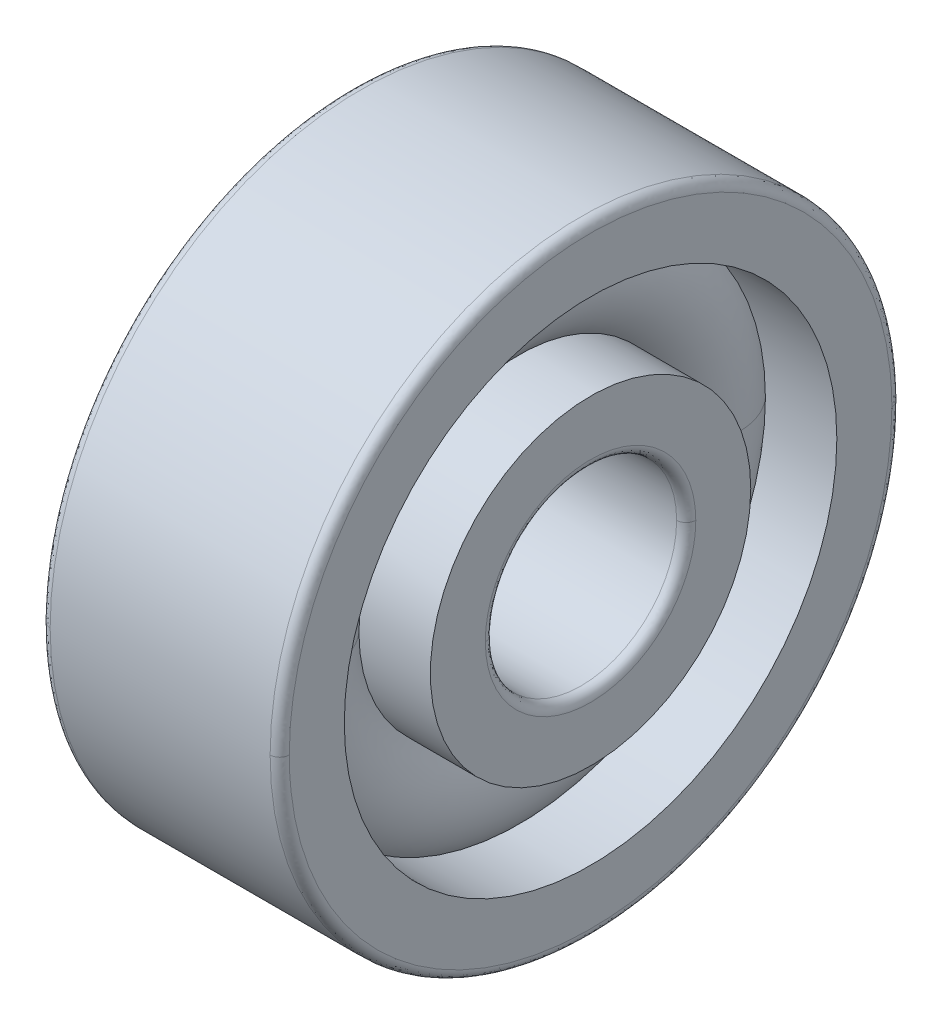
ISO-10303-21;
HEADER;
FILE_DESCRIPTION(('STEP AP214'),'2;1');
FILE_NAME('part.step','',(''),(''),'','','');
FILE_SCHEMA(('AUTOMOTIVE_DESIGN { 1 0 10303 214 1 1 1 1 }'));
ENDSEC;
DATA;
#1=APPLICATION_CONTEXT('core data for automotive mechanical design processes');
#2=APPLICATION_PROTOCOL_DEFINITION('international standard','automotive_design',2000,#1);
#3=PRODUCT_CONTEXT('',#1,'mechanical');
#4=PRODUCT('Part','Part','',(#3));
#5=PRODUCT_RELATED_PRODUCT_CATEGORY('part','',(#4));
#6=PRODUCT_DEFINITION_FORMATION('','',#4);
#7=PRODUCT_DEFINITION_CONTEXT('part definition',#1,'design');
#8=PRODUCT_DEFINITION('design','',#6,#7);
#9=PRODUCT_DEFINITION_SHAPE('','',#8);
#10=(LENGTH_UNIT() NAMED_UNIT(*) SI_UNIT(.MILLI.,.METRE.));
#11=(NAMED_UNIT(*) PLANE_ANGLE_UNIT() SI_UNIT($,.RADIAN.));
#12=(NAMED_UNIT(*) SI_UNIT($,.STERADIAN.) SOLID_ANGLE_UNIT());
#13=UNCERTAINTY_MEASURE_WITH_UNIT(LENGTH_MEASURE(1.E-05),#10,'distance_accuracy_value','');
#14=(GEOMETRIC_REPRESENTATION_CONTEXT(3) GLOBAL_UNCERTAINTY_ASSIGNED_CONTEXT((#13)) GLOBAL_UNIT_ASSIGNED_CONTEXT((#10,
#11,#12)) REPRESENTATION_CONTEXT('',''));
#15=CARTESIAN_POINT('',(0.,0.,0.));
#16=DIRECTION('',(0.,0.,1.));
#17=DIRECTION('',(1.,0.,0.));
#18=AXIS2_PLACEMENT_3D('',#15,#16,#17);
#19=CARTESIAN_POINT('',(2.280033317,0.,-2.000999167));
#20=CARTESIAN_POINT('',(2.280033317,4.001998334,-2.000999167));
#21=CARTESIAN_POINT('',(2.280033317,4.001998334,2.000999167));
#22=CARTESIAN_POINT('',(2.280033317,0.,2.000999167));
#23=CARTESIAN_POINT('',(2.416010753,0.,-1.987355915));
#24=CARTESIAN_POINT('',(2.416010753,3.974711831,-1.987355915));
#25=CARTESIAN_POINT('',(2.416010753,3.974711831,1.987355915));
#26=CARTESIAN_POINT('',(2.416010753,0.,1.987355915));
#27=CARTESIAN_POINT('',(2.512644085,0.,-2.083989247));
#28=CARTESIAN_POINT('',(2.512644085,4.167978494,-2.083989247));
#29=CARTESIAN_POINT('',(2.512644085,4.167978494,2.083989247));
#30=CARTESIAN_POINT('',(2.512644085,0.,2.083989247));
#31=CARTESIAN_POINT('',(2.499000833,0.,-2.219966683));
#32=CARTESIAN_POINT('',(2.499000833,4.439933367,-2.219966683));
#33=CARTESIAN_POINT('',(2.499000833,4.439933367,2.219966683));
#34=CARTESIAN_POINT('',(2.499000833,0.,2.219966683));
#35=(BOUNDED_SURFACE() B_SPLINE_SURFACE(3,3,((#19,#20,#21,#22),(#23,#24,#25,#26),(#27,#28,#29,
#30),(#31,#32,#33,#34)),.UNSPECIFIED.,.F.,.F.,.F.) B_SPLINE_SURFACE_WITH_KNOTS((4,4),(4,4),(0.,
1.),(0.,1.),.UNSPECIFIED.) GEOMETRIC_REPRESENTATION_ITEM() RATIONAL_B_SPLINE_SURFACE(((1.,
0.333333333333333,0.333333333333333,1.),(0.755320871117972,0.251773623705991,0.251773623705991,
0.755320871117972),(0.755320871117972,0.251773623705991,0.251773623705991,0.755320871117972),
(1.,0.333333333333333,0.333333333333333,1.))) REPRESENTATION_ITEM('') SURFACE());
#36=CARTESIAN_POINT('',(2.3,0.,0.));
#37=DIRECTION('',(1.,0.,0.));
#38=DIRECTION('',(0.,0.,-1.));
#39=AXIS2_PLACEMENT_3D('',#36,#37,#38);
#40=CIRCLE('',#39,2.);
#41=CARTESIAN_POINT('',(2.30000000009351,-2.69380885286199E-10,-1.9999999999971));
#42=VERTEX_POINT('',#41);
#43=CARTESIAN_POINT('',(2.30000000009351,-6.15310285545994E-10,1.9999999999971));
#44=VERTEX_POINT('',#43);
#45=EDGE_CURVE('E765',#42,#44,#40,.T.);
#46=CARTESIAN_POINT('',(2.280033317,0.,-2.000999167));
#47=CARTESIAN_POINT('',(2.416010753,0.,-1.987355915));
#48=CARTESIAN_POINT('',(2.512644085,0.,-2.083989247));
#49=CARTESIAN_POINT('',(2.499000833,0.,-2.219966683));
#50=(BOUNDED_CURVE() B_SPLINE_CURVE(3,(#46,#47,#48,#49),.UNSPECIFIED.,.F.,
.F.) B_SPLINE_CURVE_WITH_KNOTS((4,4),(0.,1.),
.UNSPECIFIED.) CURVE() GEOMETRIC_REPRESENTATION_ITEM() RATIONAL_B_SPLINE_CURVE((1.,
0.755320871117972,0.755320871117972,1.)) REPRESENTATION_ITEM(''));
#51=CARTESIAN_POINT('',(2.50000000000696,0.,-2.19999999872542));
#52=VERTEX_POINT('',#51);
#53=EDGE_CURVE('E109',#52,#42,#50,.F.);
#54=CARTESIAN_POINT('',(2.50000000001161,0.,-2.19999999940735));
#55=CARTESIAN_POINT('',(2.50000000001161,4.39999999968315,-2.19999999940735));
#56=CARTESIAN_POINT('',(2.50000000001161,4.39999999968315,2.19999999940735));
#57=CARTESIAN_POINT('',(2.50000000001161,0.,2.19999999940735));
#58=(BOUNDED_CURVE() B_SPLINE_CURVE(3,(#54,#55,#56,#57),.UNSPECIFIED.,.F.,
.F.) B_SPLINE_CURVE_WITH_KNOTS((4,4),(0.,1.),
.UNSPECIFIED.) CURVE() GEOMETRIC_REPRESENTATION_ITEM() RATIONAL_B_SPLINE_CURVE((0.956578301732849,
0.318859433910949,0.318859433910949,0.956578301732849)) REPRESENTATION_ITEM(''));
#59=CARTESIAN_POINT('',(2.50000000000696,0.,2.19999999872542));
#60=VERTEX_POINT('',#59);
#61=EDGE_CURVE('E103',#60,#52,#58,.F.);
#62=CARTESIAN_POINT('',(2.280033317,0.,2.000999167));
#63=CARTESIAN_POINT('',(2.416010753,0.,1.987355915));
#64=CARTESIAN_POINT('',(2.512644085,0.,2.083989247));
#65=CARTESIAN_POINT('',(2.499000833,0.,2.219966683));
#66=(BOUNDED_CURVE() B_SPLINE_CURVE(3,(#62,#63,#64,#65),.UNSPECIFIED.,.F.,
.F.) B_SPLINE_CURVE_WITH_KNOTS((4,4),(0.,1.),
.UNSPECIFIED.) CURVE() GEOMETRIC_REPRESENTATION_ITEM() RATIONAL_B_SPLINE_CURVE((1.,
0.755320871117972,0.755320871117972,1.)) REPRESENTATION_ITEM(''));
#67=EDGE_CURVE('E106',#44,#60,#66,.T.);
#68=ORIENTED_EDGE('',*,*,#45,.F.);
#69=ORIENTED_EDGE('',*,*,#53,.F.);
#70=ORIENTED_EDGE('',*,*,#61,.F.);
#71=ORIENTED_EDGE('',*,*,#67,.F.);
#72=EDGE_LOOP('',(#68,#69,#70,#71));
#73=FACE_BOUND('',#72,.T.);
#74=ADVANCED_FACE('F17',(#73),#35,.T.);
#75=CARTESIAN_POINT('',(2.280033317,0.,2.000999167));
#76=CARTESIAN_POINT('',(2.280033317,-4.001998334,2.000999167));
#77=CARTESIAN_POINT('',(2.280033317,-4.001998334,-2.000999167));
#78=CARTESIAN_POINT('',(2.280033317,0.,-2.000999167));
#79=CARTESIAN_POINT('',(2.416010753,0.,1.987355915));
#80=CARTESIAN_POINT('',(2.416010753,-3.974711831,1.987355915));
#81=CARTESIAN_POINT('',(2.416010753,-3.974711831,-1.987355915));
#82=CARTESIAN_POINT('',(2.416010753,0.,-1.987355915));
#83=CARTESIAN_POINT('',(2.512644085,0.,2.083989247));
#84=CARTESIAN_POINT('',(2.512644085,-4.167978494,2.083989247));
#85=CARTESIAN_POINT('',(2.512644085,-4.167978494,-2.083989247));
#86=CARTESIAN_POINT('',(2.512644085,0.,-2.083989247));
#87=CARTESIAN_POINT('',(2.499000833,0.,2.219966683));
#88=CARTESIAN_POINT('',(2.499000833,-4.439933367,2.219966683));
#89=CARTESIAN_POINT('',(2.499000833,-4.439933367,-2.219966683));
#90=CARTESIAN_POINT('',(2.499000833,0.,-2.219966683));
#91=(BOUNDED_SURFACE() B_SPLINE_SURFACE(3,3,((#75,#76,#77,#78),(#79,#80,#81,#82),(#83,#84,#85,
#86),(#87,#88,#89,#90)),.UNSPECIFIED.,.F.,.F.,.F.) B_SPLINE_SURFACE_WITH_KNOTS((4,4),(4,4),(0.,
1.),(0.,1.),.UNSPECIFIED.) GEOMETRIC_REPRESENTATION_ITEM() RATIONAL_B_SPLINE_SURFACE(((1.,
0.333333333333333,0.333333333333333,1.),(0.755320871117972,0.251773623705991,0.251773623705991,
0.755320871117972),(0.755320871117972,0.251773623705991,0.251773623705991,0.755320871117972),
(1.,0.333333333333333,0.333333333333333,1.))) REPRESENTATION_ITEM('') SURFACE());
#92=CARTESIAN_POINT('',(2.3,0.,0.));
#93=DIRECTION('',(1.,0.,0.));
#94=DIRECTION('',(0.,0.,-1.));
#95=AXIS2_PLACEMENT_3D('',#92,#93,#94);
#96=CIRCLE('',#95,2.);
#97=EDGE_CURVE('E115',#44,#42,#96,.T.);
#98=CARTESIAN_POINT('',(2.5000000000116,0.,2.19999999940735));
#99=CARTESIAN_POINT('',(2.50000000001161,-4.39999999968315,2.19999999940735));
#100=CARTESIAN_POINT('',(2.50000000001161,-4.39999999968315,-2.19999999940735));
#101=CARTESIAN_POINT('',(2.5000000000116,0.,-2.19999999940735));
#102=(BOUNDED_CURVE() B_SPLINE_CURVE(3,(#98,#99,#100,#101),.UNSPECIFIED.,.F.,
.F.) B_SPLINE_CURVE_WITH_KNOTS((4,4),(0.,1.),
.UNSPECIFIED.) CURVE() GEOMETRIC_REPRESENTATION_ITEM() RATIONAL_B_SPLINE_CURVE((0.956578301732848,
0.318859433910949,0.318859433910949,0.956578301732848)) REPRESENTATION_ITEM(''));
#103=EDGE_CURVE('E114',#52,#60,#102,.F.);
#104=ORIENTED_EDGE('',*,*,#53,.T.);
#105=ORIENTED_EDGE('',*,*,#97,.F.);
#106=ORIENTED_EDGE('',*,*,#67,.T.);
#107=ORIENTED_EDGE('',*,*,#103,.F.);
#108=EDGE_LOOP('',(#104,#105,#106,#107));
#109=FACE_BOUND('',#108,.T.);
#110=ADVANCED_FACE('F120',(#109),#91,.T.);
#111=CARTESIAN_POINT('',(-2.3,0.,0.));
#112=DIRECTION('',(1.,0.,0.));
#113=DIRECTION('',(0.,0.,-1.));
#114=AXIS2_PLACEMENT_3D('',#111,#112,#113);
#115=CYLINDRICAL_SURFACE('',#114,2.);
#116=ORIENTED_EDGE('',*,*,#45,.T.);
#117=ORIENTED_EDGE('',*,*,#97,.T.);
#118=EDGE_LOOP('',(#116,#117));
#119=FACE_BOUND('',#118,.T.);
#120=CARTESIAN_POINT('',(-2.30000000037402,0.,0.));
#121=DIRECTION('',(1.,0.,0.));
#122=DIRECTION('',(0.,1.,0.));
#123=AXIS2_PLACEMENT_3D('',#120,#121,#122);
#124=CIRCLE('',#123,1.99999999998839);
#125=CARTESIAN_POINT('',(-2.30000000037402,-2.05103428515331E-10,1.9999999999913));
#126=VERTEX_POINT('',#125);
#127=CARTESIAN_POINT('',(-2.30000000028051,-8.9793628428733E-11,-1.9999999999913));
#128=VERTEX_POINT('',#127);
#129=EDGE_CURVE('E325',#126,#128,#124,.T.);
#130=ORIENTED_EDGE('',*,*,#129,.F.);
#131=CARTESIAN_POINT('',(-2.30000000037402,0.,0.));
#132=DIRECTION('',(1.,0.,0.));
#133=DIRECTION('',(0.,1.,0.));
#134=AXIS2_PLACEMENT_3D('',#131,#132,#133);
#135=CIRCLE('',#134,1.99999999998839);
#136=EDGE_CURVE('E127',#128,#126,#135,.T.);
#137=ORIENTED_EDGE('',*,*,#136,.F.);
#138=EDGE_LOOP('',(#130,#137));
#139=FACE_BOUND('',#138,.T.);
#140=ADVANCED_FACE('F148',(#119,#139),#115,.F.);
#141=CARTESIAN_POINT('',(2.5,-3.3902,3.3902));
#142=DIRECTION('',(1.,0.,0.));
#143=DIRECTION('',(0.,0.,-1.));
#144=AXIS2_PLACEMENT_3D('',#141,#142,#143);
#145=PLANE('',#144);
#146=ORIENTED_EDGE('',*,*,#61,.T.);
#147=ORIENTED_EDGE('',*,*,#103,.T.);
#148=EDGE_LOOP('',(#146,#147));
#149=FACE_BOUND('',#148,.T.);
#150=CARTESIAN_POINT('',(2.5,0.,0.));
#151=DIRECTION('',(1.,0.,0.));
#152=DIRECTION('',(0.,0.,-1.));
#153=AXIS2_PLACEMENT_3D('',#150,#151,#152);
#154=CIRCLE('',#153,3.35);
#155=CARTESIAN_POINT('',(2.5,0.,-3.35));
#156=VERTEX_POINT('',#155);
#157=EDGE_CURVE('E22',#156,#156,#154,.T.);
#158=ORIENTED_EDGE('',*,*,#157,.T.);
#159=EDGE_LOOP('',(#158));
#160=FACE_BOUND('',#159,.T.);
#161=ADVANCED_FACE('F125',(#149,#160),#145,.T.);
#162=CARTESIAN_POINT('',(-2.499000833,0.,-2.219966683));
#163=CARTESIAN_POINT('',(-2.499000833,4.439933367,-2.219966683));
#164=CARTESIAN_POINT('',(-2.499000833,4.439933367,2.219966683));
#165=CARTESIAN_POINT('',(-2.499000833,0.,2.219966683));
#166=CARTESIAN_POINT('',(-2.512644085,0.,-2.083989247));
#167=CARTESIAN_POINT('',(-2.512644085,4.167978494,-2.083989247));
#168=CARTESIAN_POINT('',(-2.512644085,4.167978494,2.083989247));
#169=CARTESIAN_POINT('',(-2.512644085,0.,2.083989247));
#170=CARTESIAN_POINT('',(-2.416010753,0.,-1.987355915));
#171=CARTESIAN_POINT('',(-2.416010753,3.974711831,-1.987355915));
#172=CARTESIAN_POINT('',(-2.416010753,3.974711831,1.987355915));
#173=CARTESIAN_POINT('',(-2.416010753,0.,1.987355915));
#174=CARTESIAN_POINT('',(-2.280033317,0.,-2.000999167));
#175=CARTESIAN_POINT('',(-2.280033317,4.001998334,-2.000999167));
#176=CARTESIAN_POINT('',(-2.280033317,4.001998334,2.000999167));
#177=CARTESIAN_POINT('',(-2.280033317,0.,2.000999167));
#178=(BOUNDED_SURFACE() B_SPLINE_SURFACE(3,3,((#162,#163,#164,#165),(#166,#167,#168,#169),(#170,
#171,#172,#173),(#174,#175,#176,#177)),.UNSPECIFIED.,.F.,.F.,
.F.) B_SPLINE_SURFACE_WITH_KNOTS((4,4),(4,4),(0.,1.),(0.,1.),
.UNSPECIFIED.) GEOMETRIC_REPRESENTATION_ITEM() RATIONAL_B_SPLINE_SURFACE(((1.,0.333333333333333,
0.333333333333333,1.),(0.755320871117972,0.251773623705991,0.251773623705991,0.755320871117972),
(0.755320871117972,0.251773623705991,0.251773623705991,0.755320871117972),(1.,0.333333333333333,
0.333333333333333,1.))) REPRESENTATION_ITEM('') SURFACE());
#179=CARTESIAN_POINT('',(-2.50000000001161,0.,2.19999999940735));
#180=CARTESIAN_POINT('',(-2.5000000000116,4.39999999968315,2.19999999940735));
#181=CARTESIAN_POINT('',(-2.5000000000116,4.39999999968315,-2.19999999940735));
#182=CARTESIAN_POINT('',(-2.50000000001161,0.,-2.19999999940735));
#183=(BOUNDED_CURVE() B_SPLINE_CURVE(3,(#179,#180,#181,#182),.UNSPECIFIED.,.F.,
.F.) B_SPLINE_CURVE_WITH_KNOTS((4,4),(0.,1.),
.UNSPECIFIED.) CURVE() GEOMETRIC_REPRESENTATION_ITEM() RATIONAL_B_SPLINE_CURVE((0.956578301732849,
0.318859433910949,0.318859433910949,0.956578301732849)) REPRESENTATION_ITEM(''));
#184=CARTESIAN_POINT('',(-2.50000000000696,0.,-2.19999999872542));
#185=VERTEX_POINT('',#184);
#186=CARTESIAN_POINT('',(-2.50000000000696,0.,2.19999999872542));
#187=VERTEX_POINT('',#186);
#188=EDGE_CURVE('E457',#185,#187,#183,.F.);
#189=CARTESIAN_POINT('',(-2.499000833,0.,-2.219966683));
#190=CARTESIAN_POINT('',(-2.512644085,0.,-2.083989247));
#191=CARTESIAN_POINT('',(-2.416010753,0.,-1.987355915));
#192=CARTESIAN_POINT('',(-2.280033317,0.,-2.000999167));
#193=(BOUNDED_CURVE() B_SPLINE_CURVE(3,(#189,#190,#191,#192),.UNSPECIFIED.,.F.,
.F.) B_SPLINE_CURVE_WITH_KNOTS((4,4),(0.,1.),
.UNSPECIFIED.) CURVE() GEOMETRIC_REPRESENTATION_ITEM() RATIONAL_B_SPLINE_CURVE((1.,
0.755320871117972,0.755320871117972,1.)) REPRESENTATION_ITEM(''));
#194=EDGE_CURVE('E279',#128,#185,#193,.F.);
#195=CARTESIAN_POINT('',(-2.499000833,0.,2.219966683));
#196=CARTESIAN_POINT('',(-2.512644085,0.,2.083989247));
#197=CARTESIAN_POINT('',(-2.416010753,0.,1.987355915));
#198=CARTESIAN_POINT('',(-2.280033317,0.,2.000999167));
#199=(BOUNDED_CURVE() B_SPLINE_CURVE(3,(#195,#196,#197,#198),.UNSPECIFIED.,.F.,
.F.) B_SPLINE_CURVE_WITH_KNOTS((4,4),(0.,1.),
.UNSPECIFIED.) CURVE() GEOMETRIC_REPRESENTATION_ITEM() RATIONAL_B_SPLINE_CURVE((1.,
0.755320871117972,0.755320871117972,1.)) REPRESENTATION_ITEM(''));
#200=EDGE_CURVE('E322',#187,#126,#199,.T.);
#201=ORIENTED_EDGE('',*,*,#188,.F.);
#202=ORIENTED_EDGE('',*,*,#194,.F.);
#203=ORIENTED_EDGE('',*,*,#136,.T.);
#204=ORIENTED_EDGE('',*,*,#200,.F.);
#205=EDGE_LOOP('',(#201,#202,#203,#204));
#206=FACE_BOUND('',#205,.T.);
#207=ADVANCED_FACE('F147',(#206),#178,.T.);
#208=CARTESIAN_POINT('',(-2.499000833,0.,2.219966683));
#209=CARTESIAN_POINT('',(-2.499000833,-4.439933367,2.219966683));
#210=CARTESIAN_POINT('',(-2.499000833,-4.439933367,-2.219966683));
#211=CARTESIAN_POINT('',(-2.499000833,0.,-2.219966683));
#212=CARTESIAN_POINT('',(-2.512644085,0.,2.083989247));
#213=CARTESIAN_POINT('',(-2.512644085,-4.167978494,2.083989247));
#214=CARTESIAN_POINT('',(-2.512644085,-4.167978494,-2.083989247));
#215=CARTESIAN_POINT('',(-2.512644085,0.,-2.083989247));
#216=CARTESIAN_POINT('',(-2.416010753,0.,1.987355915));
#217=CARTESIAN_POINT('',(-2.416010753,-3.974711831,1.987355915));
#218=CARTESIAN_POINT('',(-2.416010753,-3.974711831,-1.987355915));
#219=CARTESIAN_POINT('',(-2.416010753,0.,-1.987355915));
#220=CARTESIAN_POINT('',(-2.280033317,0.,2.000999167));
#221=CARTESIAN_POINT('',(-2.280033317,-4.001998334,2.000999167));
#222=CARTESIAN_POINT('',(-2.280033317,-4.001998334,-2.000999167));
#223=CARTESIAN_POINT('',(-2.280033317,0.,-2.000999167));
#224=(BOUNDED_SURFACE() B_SPLINE_SURFACE(3,3,((#208,#209,#210,#211),(#212,#213,#214,#215),(#216,
#217,#218,#219),(#220,#221,#222,#223)),.UNSPECIFIED.,.F.,.F.,
.F.) B_SPLINE_SURFACE_WITH_KNOTS((4,4),(4,4),(0.,1.),(0.,1.),
.UNSPECIFIED.) GEOMETRIC_REPRESENTATION_ITEM() RATIONAL_B_SPLINE_SURFACE(((1.,0.333333333333333,
0.333333333333333,1.),(0.755320871117972,0.251773623705991,0.251773623705991,0.755320871117972),
(0.755320871117972,0.251773623705991,0.251773623705991,0.755320871117972),(1.,0.333333333333333,
0.333333333333333,1.))) REPRESENTATION_ITEM('') SURFACE());
#225=CARTESIAN_POINT('',(-2.5000000000116,0.,-2.19999999940735));
#226=CARTESIAN_POINT('',(-2.50000000001161,-4.39999999968315,-2.19999999940735));
#227=CARTESIAN_POINT('',(-2.50000000001161,-4.39999999968315,2.19999999940735));
#228=CARTESIAN_POINT('',(-2.5000000000116,0.,2.19999999940735));
#229=(BOUNDED_CURVE() B_SPLINE_CURVE(3,(#225,#226,#227,#228),.UNSPECIFIED.,.F.,
.F.) B_SPLINE_CURVE_WITH_KNOTS((4,4),(0.,1.),
.UNSPECIFIED.) CURVE() GEOMETRIC_REPRESENTATION_ITEM() RATIONAL_B_SPLINE_CURVE((0.956578301732848,
0.318859433910949,0.318859433910949,0.956578301732848)) REPRESENTATION_ITEM(''));
#230=EDGE_CURVE('E265',#187,#185,#229,.F.);
#231=ORIENTED_EDGE('',*,*,#194,.T.);
#232=ORIENTED_EDGE('',*,*,#230,.F.);
#233=ORIENTED_EDGE('',*,*,#200,.T.);
#234=ORIENTED_EDGE('',*,*,#129,.T.);
#235=EDGE_LOOP('',(#231,#232,#233,#234));
#236=FACE_BOUND('',#235,.T.);
#237=ADVANCED_FACE('F281',(#236),#224,.T.);
#238=CARTESIAN_POINT('',(1.00623059,0.,0.));
#239=DIRECTION('',(1.,0.,0.));
#240=DIRECTION('',(0.,0.,-1.));
#241=AXIS2_PLACEMENT_3D('',#238,#239,#240);
#242=CYLINDRICAL_SURFACE('',#241,3.35);
#243=CARTESIAN_POINT('',(1.00623058937326,0.,0.));
#244=DIRECTION('',(-1.,0.,0.));
#245=DIRECTION('',(0.,-1.,0.));
#246=AXIS2_PLACEMENT_3D('',#243,#244,#245);
#247=CIRCLE('',#246,3.35000000003667);
#248=CARTESIAN_POINT('',(1.00623058937326,-1.50404327618128E-10,-3.3500000000275));
#249=VERTEX_POINT('',#248);
#250=CARTESIAN_POINT('',(1.00623058952994,-3.4354824276318E-10,3.3500000000275));
#251=VERTEX_POINT('',#250);
#252=EDGE_CURVE('E241',#249,#251,#247,.T.);
#253=ORIENTED_EDGE('',*,*,#252,.F.);
#254=CARTESIAN_POINT('',(1.00623058937326,0.,0.));
#255=DIRECTION('',(-1.,0.,0.));
#256=DIRECTION('',(0.,-1.,0.));
#257=AXIS2_PLACEMENT_3D('',#254,#255,#256);
#258=CIRCLE('',#257,3.35000000003667);
#259=EDGE_CURVE('E260',#251,#249,#258,.T.);
#260=ORIENTED_EDGE('',*,*,#259,.F.);
#261=EDGE_LOOP('',(#253,#260));
#262=FACE_BOUND('',#261,.T.);
#263=ORIENTED_EDGE('',*,*,#157,.F.);
#264=EDGE_LOOP('',(#263));
#265=FACE_BOUND('',#264,.T.);
#266=ADVANCED_FACE('F158',(#262,#265),#242,.T.);
#267=CARTESIAN_POINT('',(-2.5,-3.3902,-3.3902));
#268=DIRECTION('',(-1.,0.,0.));
#269=DIRECTION('',(0.,0.,1.));
#270=AXIS2_PLACEMENT_3D('',#267,#268,#269);
#271=PLANE('',#270);
#272=ORIENTED_EDGE('',*,*,#188,.T.);
#273=ORIENTED_EDGE('',*,*,#230,.T.);
#274=EDGE_LOOP('',(#272,#273));
#275=FACE_BOUND('',#274,.T.);
#276=CARTESIAN_POINT('',(-2.5,0.,0.));
#277=DIRECTION('',(1.,0.,0.));
#278=DIRECTION('',(0.,1.,0.));
#279=AXIS2_PLACEMENT_3D('',#276,#277,#278);
#280=CIRCLE('',#279,3.35);
#281=CARTESIAN_POINT('',(-2.5,3.35,0.));
#282=VERTEX_POINT('',#281);
#283=EDGE_CURVE('E231',#282,#282,#280,.F.);
#284=ORIENTED_EDGE('',*,*,#283,.T.);
#285=EDGE_LOOP('',(#284));
#286=FACE_BOUND('',#285,.T.);
#287=ADVANCED_FACE('F153',(#275,#286),#271,.T.);
#288=CARTESIAN_POINT('',(0.911353553,0.,5.245959186));
#289=CARTESIAN_POINT('',(0.911353553,10.491918373,5.245959186));
#290=CARTESIAN_POINT('',(0.911353553,10.491918373,-5.245959186));
#291=CARTESIAN_POINT('',(0.911353553,0.,-5.245959186));
#292=CARTESIAN_POINT('',(1.536645878,0.,4.673784754));
#293=CARTESIAN_POINT('',(1.536645878,9.347569509,4.673784754));
#294=CARTESIAN_POINT('',(1.536645878,9.347569509,-4.673784754));
#295=CARTESIAN_POINT('',(1.536645878,0.,-4.673784754));
#296=CARTESIAN_POINT('',(1.536645878,0.,3.826215246));
#297=CARTESIAN_POINT('',(1.536645878,7.652430491,3.826215246));
#298=CARTESIAN_POINT('',(1.536645878,7.652430491,-3.826215246));
#299=CARTESIAN_POINT('',(1.536645878,0.,-3.826215246));
#300=CARTESIAN_POINT('',(0.911353553,0.,3.254040814));
#301=CARTESIAN_POINT('',(0.911353553,6.508081627,3.254040814));
#302=CARTESIAN_POINT('',(0.911353553,6.508081627,-3.254040814));
#303=CARTESIAN_POINT('',(0.911353553,0.,-3.254040814));
#304=(BOUNDED_SURFACE() B_SPLINE_SURFACE(3,3,((#288,#289,#290,#291),(#292,#293,#294,#295),(#296,
#297,#298,#299),(#300,#301,#302,#303)),.UNSPECIFIED.,.F.,.F.,
.F.) B_SPLINE_SURFACE_WITH_KNOTS((4,4),(4,4),(0.,1.),(0.,1.),
.UNSPECIFIED.) GEOMETRIC_REPRESENTATION_ITEM() RATIONAL_B_SPLINE_SURFACE(((1.,0.333333333333333,
0.333333333333333,1.),(0.783384470702986,0.261128156900996,0.261128156900996,0.783384470702986),
(0.783384470702986,0.261128156900996,0.261128156900996,0.783384470702986),(1.,0.333333333333333,
0.333333333333333,1.))) REPRESENTATION_ITEM('') SURFACE());
#305=CARTESIAN_POINT('',(1.00623059,0.,0.));
#306=DIRECTION('',(1.,0.,0.));
#307=DIRECTION('',(0.,0.,-1.));
#308=AXIS2_PLACEMENT_3D('',#305,#306,#307);
#309=CIRCLE('',#308,5.15);
#310=CARTESIAN_POINT('',(1.00623058984332,-1.58442398528093E-09,5.14999999999083));
#311=VERTEX_POINT('',#310);
#312=CARTESIAN_POINT('',(1.00623058984332,-6.93655779611963E-10,-5.14999999999083));
#313=VERTEX_POINT('',#312);
#314=EDGE_CURVE('E233',#311,#313,#309,.F.);
#315=CARTESIAN_POINT('',(0.911353553,0.,5.245959186));
#316=CARTESIAN_POINT('',(1.536645878,0.,4.673784754));
#317=CARTESIAN_POINT('',(1.536645878,0.,3.826215246));
#318=CARTESIAN_POINT('',(0.911353553,0.,3.254040814));
#319=(BOUNDED_CURVE() B_SPLINE_CURVE(3,(#315,#316,#317,#318),.UNSPECIFIED.,.F.,
.F.) B_SPLINE_CURVE_WITH_KNOTS((4,4),(0.,1.),
.UNSPECIFIED.) CURVE() GEOMETRIC_REPRESENTATION_ITEM() RATIONAL_B_SPLINE_CURVE((1.,
0.783384470702986,0.783384470702986,1.)) REPRESENTATION_ITEM(''));
#320=EDGE_CURVE('E234',#251,#311,#319,.F.);
#321=CARTESIAN_POINT('',(0.911353553,0.,-5.245959186));
#322=CARTESIAN_POINT('',(1.536645878,0.,-4.673784754));
#323=CARTESIAN_POINT('',(1.536645878,0.,-3.826215246));
#324=CARTESIAN_POINT('',(0.911353553,0.,-3.254040814));
#325=(BOUNDED_CURVE() B_SPLINE_CURVE(3,(#321,#322,#323,#324),.UNSPECIFIED.,.F.,
.F.) B_SPLINE_CURVE_WITH_KNOTS((4,4),(0.,1.),
.UNSPECIFIED.) CURVE() GEOMETRIC_REPRESENTATION_ITEM() RATIONAL_B_SPLINE_CURVE((1.,
0.783384470702986,0.783384470702986,1.)) REPRESENTATION_ITEM(''));
#326=EDGE_CURVE('E248',#313,#249,#325,.T.);
#327=ORIENTED_EDGE('',*,*,#314,.F.);
#328=ORIENTED_EDGE('',*,*,#320,.F.);
#329=ORIENTED_EDGE('',*,*,#259,.T.);
#330=ORIENTED_EDGE('',*,*,#326,.F.);
#331=EDGE_LOOP('',(#327,#328,#329,#330));
#332=FACE_BOUND('',#331,.T.);
#333=ADVANCED_FACE('F157',(#332),#304,.T.);
#334=CARTESIAN_POINT('',(0.911353553,0.,-5.245959186));
#335=CARTESIAN_POINT('',(0.911353553,-10.491918373,-5.245959186));
#336=CARTESIAN_POINT('',(0.911353553,-10.491918373,5.245959186));
#337=CARTESIAN_POINT('',(0.911353553,0.,5.245959186));
#338=CARTESIAN_POINT('',(1.536645878,0.,-4.673784754));
#339=CARTESIAN_POINT('',(1.536645878,-9.347569509,-4.673784754));
#340=CARTESIAN_POINT('',(1.536645878,-9.347569509,4.673784754));
#341=CARTESIAN_POINT('',(1.536645878,0.,4.673784754));
#342=CARTESIAN_POINT('',(1.536645878,0.,-3.826215246));
#343=CARTESIAN_POINT('',(1.536645878,-7.652430491,-3.826215246));
#344=CARTESIAN_POINT('',(1.536645878,-7.652430491,3.826215246));
#345=CARTESIAN_POINT('',(1.536645878,0.,3.826215246));
#346=CARTESIAN_POINT('',(0.911353553,0.,-3.254040814));
#347=CARTESIAN_POINT('',(0.911353553,-6.508081627,-3.254040814));
#348=CARTESIAN_POINT('',(0.911353553,-6.508081627,3.254040814));
#349=CARTESIAN_POINT('',(0.911353553,0.,3.254040814));
#350=(BOUNDED_SURFACE() B_SPLINE_SURFACE(3,3,((#334,#335,#336,#337),(#338,#339,#340,#341),(#342,
#343,#344,#345),(#346,#347,#348,#349)),.UNSPECIFIED.,.F.,.F.,
.F.) B_SPLINE_SURFACE_WITH_KNOTS((4,4),(4,4),(0.,1.),(0.,1.),
.UNSPECIFIED.) GEOMETRIC_REPRESENTATION_ITEM() RATIONAL_B_SPLINE_SURFACE(((1.,0.333333333333333,
0.333333333333333,1.),(0.783384470702986,0.261128156900996,0.261128156900996,0.783384470702986),
(0.783384470702986,0.261128156900996,0.261128156900996,0.783384470702986),(1.,0.333333333333333,
0.333333333333333,1.))) REPRESENTATION_ITEM('') SURFACE());
#351=CARTESIAN_POINT('',(1.00623059,0.,0.));
#352=DIRECTION('',(1.,0.,0.));
#353=DIRECTION('',(0.,0.,-1.));
#354=AXIS2_PLACEMENT_3D('',#351,#352,#353);
#355=CIRCLE('',#354,5.15);
#356=EDGE_CURVE('E238',#313,#311,#355,.F.);
#357=ORIENTED_EDGE('',*,*,#320,.T.);
#358=ORIENTED_EDGE('',*,*,#356,.F.);
#359=ORIENTED_EDGE('',*,*,#326,.T.);
#360=ORIENTED_EDGE('',*,*,#252,.T.);
#361=EDGE_LOOP('',(#357,#358,#359,#360));
#362=FACE_BOUND('',#361,.T.);
#363=ADVANCED_FACE('F449',(#362),#350,.T.);
#364=CARTESIAN_POINT('',(-2.5,0.,0.));
#365=DIRECTION('',(1.,0.,0.));
#366=DIRECTION('',(0.,1.,0.));
#367=AXIS2_PLACEMENT_3D('',#364,#365,#366);
#368=CYLINDRICAL_SURFACE('',#367,3.35);
#369=ORIENTED_EDGE('',*,*,#283,.F.);
#370=EDGE_LOOP('',(#369));
#371=FACE_BOUND('',#370,.T.);
#372=CARTESIAN_POINT('',(-1.00623058937326,0.,0.));
#373=DIRECTION('',(1.,0.,0.));
#374=DIRECTION('',(0.,1.,0.));
#375=AXIS2_PLACEMENT_3D('',#372,#373,#374);
#376=CIRCLE('',#375,3.35000000003667);
#377=CARTESIAN_POINT('',(-1.00623058937326,-2.25606491427603E-10,-3.3500000000275));
#378=VERTEX_POINT('',#377);
#379=CARTESIAN_POINT('',(-1.00623058937326,-3.4354824276318E-10,3.3500000000275));
#380=VERTEX_POINT('',#379);
#381=EDGE_CURVE('E429',#378,#380,#376,.T.);
#382=ORIENTED_EDGE('',*,*,#381,.F.);
#383=CARTESIAN_POINT('',(-1.00623058937326,0.,0.));
#384=DIRECTION('',(1.,0.,0.));
#385=DIRECTION('',(0.,1.,0.));
#386=AXIS2_PLACEMENT_3D('',#383,#384,#385);
#387=CIRCLE('',#386,3.35000000003667);
#388=EDGE_CURVE('E230',#380,#378,#387,.T.);
#389=ORIENTED_EDGE('',*,*,#388,.F.);
#390=EDGE_LOOP('',(#382,#389));
#391=FACE_BOUND('',#390,.T.);
#392=ADVANCED_FACE('F495',(#371,#391),#368,.T.);
#393=CARTESIAN_POINT('',(1.00623059,0.,0.));
#394=DIRECTION('',(1.,0.,0.));
#395=DIRECTION('',(0.,0.,-1.));
#396=AXIS2_PLACEMENT_3D('',#393,#394,#395);
#397=CYLINDRICAL_SURFACE('',#396,5.15);
#398=CARTESIAN_POINT('',(2.5,0.,0.));
#399=DIRECTION('',(1.,0.,0.));
#400=DIRECTION('',(0.,0.,-1.));
#401=AXIS2_PLACEMENT_3D('',#398,#399,#400);
#402=CIRCLE('',#401,5.15);
#403=CARTESIAN_POINT('',(2.5,0.,-5.15));
#404=VERTEX_POINT('',#403);
#405=EDGE_CURVE('E228',#404,#404,#402,.F.);
#406=ORIENTED_EDGE('',*,*,#405,.F.);
#407=EDGE_LOOP('',(#406));
#408=FACE_BOUND('',#407,.T.);
#409=ORIENTED_EDGE('',*,*,#356,.T.);
#410=ORIENTED_EDGE('',*,*,#314,.T.);
#411=EDGE_LOOP('',(#409,#410));
#412=FACE_BOUND('',#411,.T.);
#413=ADVANCED_FACE('F502',(#408,#412),#397,.F.);
#414=CARTESIAN_POINT('',(-0.911353553,0.,3.254040814));
#415=CARTESIAN_POINT('',(-0.911353553,6.508081627,3.254040814));
#416=CARTESIAN_POINT('',(-0.911353553,6.508081627,-3.254040814));
#417=CARTESIAN_POINT('',(-0.911353553,0.,-3.254040814));
#418=CARTESIAN_POINT('',(-1.536645878,0.,3.826215246));
#419=CARTESIAN_POINT('',(-1.536645878,7.652430491,3.826215246));
#420=CARTESIAN_POINT('',(-1.536645878,7.652430491,-3.826215246));
#421=CARTESIAN_POINT('',(-1.536645878,0.,-3.826215246));
#422=CARTESIAN_POINT('',(-1.536645878,0.,4.673784754));
#423=CARTESIAN_POINT('',(-1.536645878,9.347569509,4.673784754));
#424=CARTESIAN_POINT('',(-1.536645878,9.347569509,-4.673784754));
#425=CARTESIAN_POINT('',(-1.536645878,0.,-4.673784754));
#426=CARTESIAN_POINT('',(-0.911353553,0.,5.245959186));
#427=CARTESIAN_POINT('',(-0.911353553,10.491918373,5.245959186));
#428=CARTESIAN_POINT('',(-0.911353553,10.491918373,-5.245959186));
#429=CARTESIAN_POINT('',(-0.911353553,0.,-5.245959186));
#430=(BOUNDED_SURFACE() B_SPLINE_SURFACE(3,3,((#414,#415,#416,#417),(#418,#419,#420,#421),(#422,
#423,#424,#425),(#426,#427,#428,#429)),.UNSPECIFIED.,.F.,.F.,
.F.) B_SPLINE_SURFACE_WITH_KNOTS((4,4),(4,4),(0.,1.),(0.,1.),
.UNSPECIFIED.) GEOMETRIC_REPRESENTATION_ITEM() RATIONAL_B_SPLINE_SURFACE(((1.,0.333333333333333,
0.333333333333333,1.),(0.783384470702986,0.261128156900996,0.261128156900996,0.783384470702986),
(0.783384470702986,0.261128156900996,0.261128156900996,0.783384470702986),(1.,0.333333333333333,
0.333333333333333,1.))) REPRESENTATION_ITEM('') SURFACE());
#431=CARTESIAN_POINT('',(-0.911353553,0.,3.254040814));
#432=CARTESIAN_POINT('',(-1.536645878,0.,3.826215246));
#433=CARTESIAN_POINT('',(-1.536645878,0.,4.673784754));
#434=CARTESIAN_POINT('',(-0.911353553,0.,5.245959186));
#435=(BOUNDED_CURVE() B_SPLINE_CURVE(3,(#431,#432,#433,#434),.UNSPECIFIED.,.F.,
.F.) B_SPLINE_CURVE_WITH_KNOTS((4,4),(0.,1.),
.UNSPECIFIED.) CURVE() GEOMETRIC_REPRESENTATION_ITEM() RATIONAL_B_SPLINE_CURVE((1.,
0.783384470702986,0.783384470702986,1.)) REPRESENTATION_ITEM(''));
#436=CARTESIAN_POINT('',(-1.0062305899084,-1.58442398528093E-09,5.14999999991807));
#437=VERTEX_POINT('',#436);
#438=EDGE_CURVE('E441',#437,#380,#435,.F.);
#439=CARTESIAN_POINT('',(-1.00623059,0.,0.));
#440=DIRECTION('',(1.,0.,0.));
#441=DIRECTION('',(0.,0.,-1.));
#442=AXIS2_PLACEMENT_3D('',#439,#440,#441);
#443=CIRCLE('',#442,5.15);
#444=CARTESIAN_POINT('',(-1.00623058984332,-6.93655779611963E-10,-5.14999999999083));
#445=VERTEX_POINT('',#444);
#446=EDGE_CURVE('E685',#445,#437,#443,.T.);
#447=CARTESIAN_POINT('',(-0.911353553,0.,-3.254040814));
#448=CARTESIAN_POINT('',(-1.536645878,0.,-3.826215246));
#449=CARTESIAN_POINT('',(-1.536645878,0.,-4.673784754));
#450=CARTESIAN_POINT('',(-0.911353553,0.,-5.245959186));
#451=(BOUNDED_CURVE() B_SPLINE_CURVE(3,(#447,#448,#449,#450),.UNSPECIFIED.,.F.,
.F.) B_SPLINE_CURVE_WITH_KNOTS((4,4),(0.,1.),
.UNSPECIFIED.) CURVE() GEOMETRIC_REPRESENTATION_ITEM() RATIONAL_B_SPLINE_CURVE((1.,
0.783384470702986,0.783384470702986,1.)) REPRESENTATION_ITEM(''));
#452=EDGE_CURVE('E436',#378,#445,#451,.T.);
#453=ORIENTED_EDGE('',*,*,#381,.T.);
#454=ORIENTED_EDGE('',*,*,#438,.F.);
#455=ORIENTED_EDGE('',*,*,#446,.F.);
#456=ORIENTED_EDGE('',*,*,#452,.F.);
#457=EDGE_LOOP('',(#453,#454,#455,#456));
#458=FACE_BOUND('',#457,.T.);
#459=ADVANCED_FACE('F510',(#458),#430,.T.);
#460=CARTESIAN_POINT('',(-0.911353553,0.,-3.254040814));
#461=CARTESIAN_POINT('',(-0.911353553,-6.508081627,-3.254040814));
#462=CARTESIAN_POINT('',(-0.911353553,-6.508081627,3.254040814));
#463=CARTESIAN_POINT('',(-0.911353553,0.,3.254040814));
#464=CARTESIAN_POINT('',(-1.536645878,0.,-3.826215246));
#465=CARTESIAN_POINT('',(-1.536645878,-7.652430491,-3.826215246));
#466=CARTESIAN_POINT('',(-1.536645878,-7.652430491,3.826215246));
#467=CARTESIAN_POINT('',(-1.536645878,0.,3.826215246));
#468=CARTESIAN_POINT('',(-1.536645878,0.,-4.673784754));
#469=CARTESIAN_POINT('',(-1.536645878,-9.347569509,-4.673784754));
#470=CARTESIAN_POINT('',(-1.536645878,-9.347569509,4.673784754));
#471=CARTESIAN_POINT('',(-1.536645878,0.,4.673784754));
#472=CARTESIAN_POINT('',(-0.911353553,0.,-5.245959186));
#473=CARTESIAN_POINT('',(-0.911353553,-10.491918373,-5.245959186));
#474=CARTESIAN_POINT('',(-0.911353553,-10.491918373,5.245959186));
#475=CARTESIAN_POINT('',(-0.911353553,0.,5.245959186));
#476=(BOUNDED_SURFACE() B_SPLINE_SURFACE(3,3,((#460,#461,#462,#463),(#464,#465,#466,#467),(#468,
#469,#470,#471),(#472,#473,#474,#475)),.UNSPECIFIED.,.F.,.F.,
.F.) B_SPLINE_SURFACE_WITH_KNOTS((4,4),(4,4),(0.,1.),(0.,1.),
.UNSPECIFIED.) GEOMETRIC_REPRESENTATION_ITEM() RATIONAL_B_SPLINE_SURFACE(((1.,0.333333333333333,
0.333333333333333,1.),(0.783384470702986,0.261128156900996,0.261128156900996,0.783384470702986),
(0.783384470702986,0.261128156900996,0.261128156900996,0.783384470702986),(1.,0.333333333333333,
0.333333333333333,1.))) REPRESENTATION_ITEM('') SURFACE());
#477=CARTESIAN_POINT('',(-1.00623059,0.,0.));
#478=DIRECTION('',(1.,0.,0.));
#479=DIRECTION('',(0.,0.,-1.));
#480=AXIS2_PLACEMENT_3D('',#477,#478,#479);
#481=CIRCLE('',#480,5.15);
#482=EDGE_CURVE('E657',#437,#445,#481,.T.);
#483=ORIENTED_EDGE('',*,*,#438,.T.);
#484=ORIENTED_EDGE('',*,*,#388,.T.);
#485=ORIENTED_EDGE('',*,*,#452,.T.);
#486=ORIENTED_EDGE('',*,*,#482,.F.);
#487=EDGE_LOOP('',(#483,#484,#485,#486));
#488=FACE_BOUND('',#487,.T.);
#489=ADVANCED_FACE('F414',(#488),#476,.T.);
#490=CARTESIAN_POINT('',(2.5,-6.3756,6.3756));
#491=DIRECTION('',(1.,0.,0.));
#492=DIRECTION('',(0.,0.,-1.));
#493=AXIS2_PLACEMENT_3D('',#490,#491,#492);
#494=PLANE('',#493);
#495=ORIENTED_EDGE('',*,*,#405,.T.);
#496=EDGE_LOOP('',(#495));
#497=FACE_BOUND('',#496,.T.);
#498=CARTESIAN_POINT('',(2.5000000000116,0.,6.30000000059265));
#499=CARTESIAN_POINT('',(2.50000000001161,12.6000000003168,6.30000000059265));
#500=CARTESIAN_POINT('',(2.50000000001161,12.6000000003168,-6.30000000059265));
#501=CARTESIAN_POINT('',(2.5000000000116,0.,-6.30000000059265));
#502=(BOUNDED_CURVE() B_SPLINE_CURVE(3,(#498,#499,#500,#501),.UNSPECIFIED.,.F.,
.F.) B_SPLINE_CURVE_WITH_KNOTS((4,4),(0.,1.),
.UNSPECIFIED.) CURVE() GEOMETRIC_REPRESENTATION_ITEM() RATIONAL_B_SPLINE_CURVE((0.956578301732851,
0.31885943391095,0.31885943391095,0.956578301732851)) REPRESENTATION_ITEM(''));
#503=CARTESIAN_POINT('',(2.50000000000696,0.,6.29999999906194));
#504=VERTEX_POINT('',#503);
#505=CARTESIAN_POINT('',(2.50000000000696,0.,-6.29999999906194));
#506=VERTEX_POINT('',#505);
#507=EDGE_CURVE('E180',#504,#506,#502,.T.);
#508=ORIENTED_EDGE('',*,*,#507,.F.);
#509=CARTESIAN_POINT('',(2.50000000001161,0.,-6.30000000059265));
#510=CARTESIAN_POINT('',(2.5000000000116,-12.6000000003168,-6.30000000059265));
#511=CARTESIAN_POINT('',(2.5000000000116,-12.6000000003168,6.30000000059265));
#512=CARTESIAN_POINT('',(2.50000000001161,0.,6.30000000059265));
#513=(BOUNDED_CURVE() B_SPLINE_CURVE(3,(#509,#510,#511,#512),.UNSPECIFIED.,.F.,
.F.) B_SPLINE_CURVE_WITH_KNOTS((4,4),(0.,1.),
.UNSPECIFIED.) CURVE() GEOMETRIC_REPRESENTATION_ITEM() RATIONAL_B_SPLINE_CURVE((0.956578301732854,
0.318859433910951,0.318859433910951,0.956578301732854)) REPRESENTATION_ITEM(''));
#514=EDGE_CURVE('E191',#506,#504,#513,.T.);
#515=ORIENTED_EDGE('',*,*,#514,.F.);
#516=EDGE_LOOP('',(#508,#515));
#517=FACE_BOUND('',#516,.T.);
#518=ADVANCED_FACE('F160',(#497,#517),#494,.T.);
#519=CARTESIAN_POINT('',(2.499000833,0.,6.280033317));
#520=CARTESIAN_POINT('',(2.499000833,-12.560066633,6.280033317));
#521=CARTESIAN_POINT('',(2.499000833,-12.560066633,-6.280033317));
#522=CARTESIAN_POINT('',(2.499000833,0.,-6.280033317));
#523=CARTESIAN_POINT('',(2.512644085,0.,6.416010753));
#524=CARTESIAN_POINT('',(2.512644085,-12.832021506,6.416010753));
#525=CARTESIAN_POINT('',(2.512644085,-12.832021506,-6.416010753));
#526=CARTESIAN_POINT('',(2.512644085,0.,-6.416010753));
#527=CARTESIAN_POINT('',(2.416010753,0.,6.512644085));
#528=CARTESIAN_POINT('',(2.416010753,-13.025288169,6.512644085));
#529=CARTESIAN_POINT('',(2.416010753,-13.025288169,-6.512644085));
#530=CARTESIAN_POINT('',(2.416010753,0.,-6.512644085));
#531=CARTESIAN_POINT('',(2.280033317,0.,6.499000833));
#532=CARTESIAN_POINT('',(2.280033317,-12.998001666,6.499000833));
#533=CARTESIAN_POINT('',(2.280033317,-12.998001666,-6.499000833));
#534=CARTESIAN_POINT('',(2.280033317,0.,-6.499000833));
#535=(BOUNDED_SURFACE() B_SPLINE_SURFACE(3,3,((#519,#520,#521,#522),(#523,#524,#525,#526),(#527,
#528,#529,#530),(#531,#532,#533,#534)),.UNSPECIFIED.,.F.,.F.,
.F.) B_SPLINE_SURFACE_WITH_KNOTS((4,4),(4,4),(0.,1.),(0.,1.),
.UNSPECIFIED.) GEOMETRIC_REPRESENTATION_ITEM() RATIONAL_B_SPLINE_SURFACE(((1.,0.333333333333333,
0.333333333333333,1.),(0.755320871117973,0.251773623705991,0.251773623705991,0.755320871117973),
(0.755320871117973,0.251773623705991,0.251773623705991,0.755320871117973),(1.,0.333333333333333,
0.333333333333333,1.))) REPRESENTATION_ITEM('') SURFACE());
#536=CARTESIAN_POINT('',(2.499000833,0.,-6.280033317));
#537=CARTESIAN_POINT('',(2.512644085,0.,-6.416010753));
#538=CARTESIAN_POINT('',(2.416010753,0.,-6.512644085));
#539=CARTESIAN_POINT('',(2.280033317,0.,-6.499000833));
#540=(BOUNDED_CURVE() B_SPLINE_CURVE(3,(#536,#537,#538,#539),.UNSPECIFIED.,.F.,
.F.) B_SPLINE_CURVE_WITH_KNOTS((4,4),(0.,1.),
.UNSPECIFIED.) CURVE() GEOMETRIC_REPRESENTATION_ITEM() RATIONAL_B_SPLINE_CURVE((1.,
0.755320871117973,0.755320871117973,1.)) REPRESENTATION_ITEM(''));
#541=CARTESIAN_POINT('',(2.30000000023376,-2.91829292393382E-10,-6.50000000000725));
#542=VERTEX_POINT('',#541);
#543=EDGE_CURVE('E662',#506,#542,#540,.T.);
#544=CARTESIAN_POINT('',(2.499000833,0.,6.280033317));
#545=CARTESIAN_POINT('',(2.512644085,0.,6.416010753));
#546=CARTESIAN_POINT('',(2.416010753,0.,6.512644085));
#547=CARTESIAN_POINT('',(2.280033317,0.,6.499000833));
#548=(BOUNDED_CURVE() B_SPLINE_CURVE(3,(#544,#545,#546,#547),.UNSPECIFIED.,.F.,
.F.) B_SPLINE_CURVE_WITH_KNOTS((4,4),(0.,1.),
.UNSPECIFIED.) CURVE() GEOMETRIC_REPRESENTATION_ITEM() RATIONAL_B_SPLINE_CURVE((1.,
0.755320871117973,0.755320871117973,1.)) REPRESENTATION_ITEM(''));
#549=CARTESIAN_POINT('',(2.30000000028051,0.,6.50000000001161));
#550=VERTEX_POINT('',#549);
#551=EDGE_CURVE('E650',#550,#504,#548,.F.);
#552=CARTESIAN_POINT('',(2.3,0.,0.));
#553=DIRECTION('',(1.,0.,0.));
#554=DIRECTION('',(0.,0.,-1.));
#555=AXIS2_PLACEMENT_3D('',#552,#553,#554);
#556=CIRCLE('',#555,6.5);
#557=EDGE_CURVE('E668',#550,#542,#556,.T.);
#558=ORIENTED_EDGE('',*,*,#543,.F.);
#559=ORIENTED_EDGE('',*,*,#514,.T.);
#560=ORIENTED_EDGE('',*,*,#551,.F.);
#561=ORIENTED_EDGE('',*,*,#557,.T.);
#562=EDGE_LOOP('',(#558,#559,#560,#561));
#563=FACE_BOUND('',#562,.T.);
#564=ADVANCED_FACE('F402',(#563),#535,.T.);
#565=CARTESIAN_POINT('',(-2.280033317,0.,6.499000833));
#566=CARTESIAN_POINT('',(-2.280033317,-12.998001666,6.499000833));
#567=CARTESIAN_POINT('',(-2.280033317,-12.998001666,-6.499000833));
#568=CARTESIAN_POINT('',(-2.280033317,0.,-6.499000833));
#569=CARTESIAN_POINT('',(-2.416010753,0.,6.512644085));
#570=CARTESIAN_POINT('',(-2.416010753,-13.025288169,6.512644085));
#571=CARTESIAN_POINT('',(-2.416010753,-13.025288169,-6.512644085));
#572=CARTESIAN_POINT('',(-2.416010753,0.,-6.512644085));
#573=CARTESIAN_POINT('',(-2.512644085,0.,6.416010753));
#574=CARTESIAN_POINT('',(-2.512644085,-12.832021506,6.416010753));
#575=CARTESIAN_POINT('',(-2.512644085,-12.832021506,-6.416010753));
#576=CARTESIAN_POINT('',(-2.512644085,0.,-6.416010753));
#577=CARTESIAN_POINT('',(-2.499000833,0.,6.280033317));
#578=CARTESIAN_POINT('',(-2.499000833,-12.560066633,6.280033317));
#579=CARTESIAN_POINT('',(-2.499000833,-12.560066633,-6.280033317));
#580=CARTESIAN_POINT('',(-2.499000833,0.,-6.280033317));
#581=(BOUNDED_SURFACE() B_SPLINE_SURFACE(3,3,((#565,#566,#567,#568),(#569,#570,#571,#572),(#573,
#574,#575,#576),(#577,#578,#579,#580)),.UNSPECIFIED.,.F.,.F.,
.F.) B_SPLINE_SURFACE_WITH_KNOTS((4,4),(4,4),(0.,1.),(0.,1.),
.UNSPECIFIED.) GEOMETRIC_REPRESENTATION_ITEM() RATIONAL_B_SPLINE_SURFACE(((1.,0.333333333333333,
0.333333333333333,1.),(0.755320871117973,0.251773623705991,0.251773623705991,0.755320871117973),
(0.755320871117973,0.251773623705991,0.251773623705991,0.755320871117973),(1.,0.333333333333333,
0.333333333333333,1.))) REPRESENTATION_ITEM('') SURFACE());
#582=CARTESIAN_POINT('',(-2.280033317,0.,-6.499000833));
#583=CARTESIAN_POINT('',(-2.416010753,0.,-6.512644085));
#584=CARTESIAN_POINT('',(-2.512644085,0.,-6.416010753));
#585=CARTESIAN_POINT('',(-2.499000833,0.,-6.280033317));
#586=(BOUNDED_CURVE() B_SPLINE_CURVE(3,(#582,#583,#584,#585),.UNSPECIFIED.,.F.,
.F.) B_SPLINE_CURVE_WITH_KNOTS((4,4),(0.,1.),
.UNSPECIFIED.) CURVE() GEOMETRIC_REPRESENTATION_ITEM() RATIONAL_B_SPLINE_CURVE((1.,
0.755320871117973,0.755320871117973,1.)) REPRESENTATION_ITEM(''));
#587=CARTESIAN_POINT('',(-2.50000000000696,0.,-6.29999999906194));
#588=VERTEX_POINT('',#587);
#589=CARTESIAN_POINT('',(-2.30000000037402,0.,-6.50000000001161));
#590=VERTEX_POINT('',#589);
#591=EDGE_CURVE('E37',#588,#590,#586,.F.);
#592=CARTESIAN_POINT('',(-2.3,0.,0.));
#593=DIRECTION('',(1.,0.,0.));
#594=DIRECTION('',(0.,0.,-1.));
#595=AXIS2_PLACEMENT_3D('',#592,#593,#594);
#596=CIRCLE('',#595,6.5);
#597=CARTESIAN_POINT('',(-2.30000000024545,-1.16652574968083E-09,6.5000000000058));
#598=VERTEX_POINT('',#597);
#599=EDGE_CURVE('E682',#590,#598,#596,.F.);
#600=CARTESIAN_POINT('',(-2.280033317,0.,6.499000833));
#601=CARTESIAN_POINT('',(-2.416010753,0.,6.512644085));
#602=CARTESIAN_POINT('',(-2.512644085,0.,6.416010753));
#603=CARTESIAN_POINT('',(-2.499000833,0.,6.280033317));
#604=(BOUNDED_CURVE() B_SPLINE_CURVE(3,(#600,#601,#602,#603),.UNSPECIFIED.,.F.,
.F.) B_SPLINE_CURVE_WITH_KNOTS((4,4),(0.,1.),
.UNSPECIFIED.) CURVE() GEOMETRIC_REPRESENTATION_ITEM() RATIONAL_B_SPLINE_CURVE((1.,
0.755320871117973,0.755320871117973,1.)) REPRESENTATION_ITEM(''));
#605=CARTESIAN_POINT('',(-2.50000000000696,0.,6.29999999906194));
#606=VERTEX_POINT('',#605);
#607=EDGE_CURVE('E387',#598,#606,#604,.T.);
#608=CARTESIAN_POINT('',(-2.50000000001161,0.,6.30000000059265));
#609=CARTESIAN_POINT('',(-2.5000000000116,-12.6000000003168,6.30000000059265));
#610=CARTESIAN_POINT('',(-2.5000000000116,-12.6000000003168,-6.30000000059265));
#611=CARTESIAN_POINT('',(-2.50000000001161,0.,-6.30000000059265));
#612=(BOUNDED_CURVE() B_SPLINE_CURVE(3,(#608,#609,#610,#611),.UNSPECIFIED.,.F.,
.F.) B_SPLINE_CURVE_WITH_KNOTS((4,4),(0.,1.),
.UNSPECIFIED.) CURVE() GEOMETRIC_REPRESENTATION_ITEM() RATIONAL_B_SPLINE_CURVE((0.956578301732857,
0.318859433910952,0.318859433910952,0.956578301732857)) REPRESENTATION_ITEM(''));
#613=EDGE_CURVE('E215',#588,#606,#612,.F.);
#614=ORIENTED_EDGE('',*,*,#591,.T.);
#615=ORIENTED_EDGE('',*,*,#599,.T.);
#616=ORIENTED_EDGE('',*,*,#607,.T.);
#617=ORIENTED_EDGE('',*,*,#613,.F.);
#618=EDGE_LOOP('',(#614,#615,#616,#617));
#619=FACE_BOUND('',#618,.T.);
#620=ADVANCED_FACE('F389',(#619),#581,.T.);
#621=CARTESIAN_POINT('',(-2.5,0.,0.));
#622=DIRECTION('',(1.,0.,0.));
#623=DIRECTION('',(0.,1.,0.));
#624=AXIS2_PLACEMENT_3D('',#621,#622,#623);
#625=CYLINDRICAL_SURFACE('',#624,5.15);
#626=ORIENTED_EDGE('',*,*,#446,.T.);
#627=ORIENTED_EDGE('',*,*,#482,.T.);
#628=EDGE_LOOP('',(#626,#627));
#629=FACE_BOUND('',#628,.T.);
#630=CARTESIAN_POINT('',(-2.5,0.,0.));
#631=DIRECTION('',(1.,0.,0.));
#632=DIRECTION('',(0.,1.,0.));
#633=AXIS2_PLACEMENT_3D('',#630,#631,#632);
#634=CIRCLE('',#633,5.15);
#635=CARTESIAN_POINT('',(-2.5,5.15,0.));
#636=VERTEX_POINT('',#635);
#637=EDGE_CURVE('E219',#636,#636,#634,.T.);
#638=ORIENTED_EDGE('',*,*,#637,.F.);
#639=EDGE_LOOP('',(#638));
#640=FACE_BOUND('',#639,.T.);
#641=ADVANCED_FACE('F401',(#629,#640),#625,.F.);
#642=CARTESIAN_POINT('',(2.499000833,0.,-6.280033317));
#643=CARTESIAN_POINT('',(2.499000833,12.560066633,-6.280033317));
#644=CARTESIAN_POINT('',(2.499000833,12.560066633,6.280033317));
#645=CARTESIAN_POINT('',(2.499000833,0.,6.280033317));
#646=CARTESIAN_POINT('',(2.512644085,0.,-6.416010753));
#647=CARTESIAN_POINT('',(2.512644085,12.832021506,-6.416010753));
#648=CARTESIAN_POINT('',(2.512644085,12.832021506,6.416010753));
#649=CARTESIAN_POINT('',(2.512644085,0.,6.416010753));
#650=CARTESIAN_POINT('',(2.416010753,0.,-6.512644085));
#651=CARTESIAN_POINT('',(2.416010753,13.025288169,-6.512644085));
#652=CARTESIAN_POINT('',(2.416010753,13.025288169,6.512644085));
#653=CARTESIAN_POINT('',(2.416010753,0.,6.512644085));
#654=CARTESIAN_POINT('',(2.280033317,0.,-6.499000833));
#655=CARTESIAN_POINT('',(2.280033317,12.998001666,-6.499000833));
#656=CARTESIAN_POINT('',(2.280033317,12.998001666,6.499000833));
#657=CARTESIAN_POINT('',(2.280033317,0.,6.499000833));
#658=(BOUNDED_SURFACE() B_SPLINE_SURFACE(3,3,((#642,#643,#644,#645),(#646,#647,#648,#649),(#650,
#651,#652,#653),(#654,#655,#656,#657)),.UNSPECIFIED.,.F.,.F.,
.F.) B_SPLINE_SURFACE_WITH_KNOTS((4,4),(4,4),(0.,1.),(0.,1.),
.UNSPECIFIED.) GEOMETRIC_REPRESENTATION_ITEM() RATIONAL_B_SPLINE_SURFACE(((1.,0.333333333333333,
0.333333333333333,1.),(0.755320871117973,0.251773623705991,0.251773623705991,0.755320871117973),
(0.755320871117973,0.251773623705991,0.251773623705991,0.755320871117973),(1.,0.333333333333333,
0.333333333333333,1.))) REPRESENTATION_ITEM('') SURFACE());
#659=CARTESIAN_POINT('',(2.3,0.,0.));
#660=DIRECTION('',(1.,0.,0.));
#661=DIRECTION('',(0.,0.,-1.));
#662=AXIS2_PLACEMENT_3D('',#659,#660,#661);
#663=CIRCLE('',#662,6.5);
#664=EDGE_CURVE('E227',#542,#550,#663,.T.);
#665=ORIENTED_EDGE('',*,*,#507,.T.);
#666=ORIENTED_EDGE('',*,*,#543,.T.);
#667=ORIENTED_EDGE('',*,*,#664,.T.);
#668=ORIENTED_EDGE('',*,*,#551,.T.);
#669=EDGE_LOOP('',(#665,#666,#667,#668));
#670=FACE_BOUND('',#669,.T.);
#671=ADVANCED_FACE('F544',(#670),#658,.T.);
#672=CARTESIAN_POINT('',(-2.5,-6.3756,-6.3756));
#673=DIRECTION('',(-1.,0.,0.));
#674=DIRECTION('',(0.,0.,1.));
#675=AXIS2_PLACEMENT_3D('',#672,#673,#674);
#676=PLANE('',#675);
#677=ORIENTED_EDGE('',*,*,#637,.T.);
#678=EDGE_LOOP('',(#677));
#679=FACE_BOUND('',#678,.T.);
#680=CARTESIAN_POINT('',(-2.50000000001161,0.,-6.30000000059265));
#681=CARTESIAN_POINT('',(-2.5000000000116,12.6000000003168,-6.30000000059265));
#682=CARTESIAN_POINT('',(-2.5000000000116,12.6000000003168,6.30000000059265));
#683=CARTESIAN_POINT('',(-2.50000000001161,0.,6.30000000059265));
#684=(BOUNDED_CURVE() B_SPLINE_CURVE(3,(#680,#681,#682,#683),.UNSPECIFIED.,.F.,
.F.) B_SPLINE_CURVE_WITH_KNOTS((4,4),(0.,1.),
.UNSPECIFIED.) CURVE() GEOMETRIC_REPRESENTATION_ITEM() RATIONAL_B_SPLINE_CURVE((0.956578301732858,
0.318859433910952,0.318859433910952,0.956578301732858)) REPRESENTATION_ITEM(''));
#685=EDGE_CURVE('E28',#588,#606,#684,.T.);
#686=ORIENTED_EDGE('',*,*,#685,.F.);
#687=ORIENTED_EDGE('',*,*,#613,.T.);
#688=EDGE_LOOP('',(#686,#687));
#689=FACE_BOUND('',#688,.T.);
#690=ADVANCED_FACE('F19',(#679,#689),#676,.T.);
#691=CARTESIAN_POINT('',(-2.3,0.,0.));
#692=DIRECTION('',(1.,0.,0.));
#693=DIRECTION('',(0.,0.,-1.));
#694=AXIS2_PLACEMENT_3D('',#691,#692,#693);
#695=CYLINDRICAL_SURFACE('',#694,6.5);
#696=ORIENTED_EDGE('',*,*,#664,.F.);
#697=ORIENTED_EDGE('',*,*,#557,.F.);
#698=EDGE_LOOP('',(#696,#697));
#699=FACE_BOUND('',#698,.T.);
#700=CARTESIAN_POINT('',(-2.30000000037402,0.,0.));
#701=DIRECTION('',(-1.,0.,0.));
#702=DIRECTION('',(0.,-1.,0.));
#703=AXIS2_PLACEMENT_3D('',#700,#701,#702);
#704=CIRCLE('',#703,6.50000000001161);
#705=EDGE_CURVE('E11',#598,#590,#704,.T.);
#706=ORIENTED_EDGE('',*,*,#705,.F.);
#707=ORIENTED_EDGE('',*,*,#599,.F.);
#708=EDGE_LOOP('',(#706,#707));
#709=FACE_BOUND('',#708,.T.);
#710=ADVANCED_FACE('F355',(#699,#709),#695,.T.);
#711=CARTESIAN_POINT('',(-2.280033317,0.,-6.499000833));
#712=CARTESIAN_POINT('',(-2.280033317,12.998001666,-6.499000833));
#713=CARTESIAN_POINT('',(-2.280033317,12.998001666,6.499000833));
#714=CARTESIAN_POINT('',(-2.280033317,0.,6.499000833));
#715=CARTESIAN_POINT('',(-2.416010753,0.,-6.512644085));
#716=CARTESIAN_POINT('',(-2.416010753,13.025288169,-6.512644085));
#717=CARTESIAN_POINT('',(-2.416010753,13.025288169,6.512644085));
#718=CARTESIAN_POINT('',(-2.416010753,0.,6.512644085));
#719=CARTESIAN_POINT('',(-2.512644085,0.,-6.416010753));
#720=CARTESIAN_POINT('',(-2.512644085,12.832021506,-6.416010753));
#721=CARTESIAN_POINT('',(-2.512644085,12.832021506,6.416010753));
#722=CARTESIAN_POINT('',(-2.512644085,0.,6.416010753));
#723=CARTESIAN_POINT('',(-2.499000833,0.,-6.280033317));
#724=CARTESIAN_POINT('',(-2.499000833,12.560066633,-6.280033317));
#725=CARTESIAN_POINT('',(-2.499000833,12.560066633,6.280033317));
#726=CARTESIAN_POINT('',(-2.499000833,0.,6.280033317));
#727=(BOUNDED_SURFACE() B_SPLINE_SURFACE(3,3,((#711,#712,#713,#714),(#715,#716,#717,#718),(#719,
#720,#721,#722),(#723,#724,#725,#726)),.UNSPECIFIED.,.F.,.F.,
.F.) B_SPLINE_SURFACE_WITH_KNOTS((4,4),(4,4),(0.,1.),(0.,1.),
.UNSPECIFIED.) GEOMETRIC_REPRESENTATION_ITEM() RATIONAL_B_SPLINE_SURFACE(((1.,0.333333333333333,
0.333333333333333,1.),(0.755320871117973,0.251773623705991,0.251773623705991,0.755320871117973),
(0.755320871117973,0.251773623705991,0.251773623705991,0.755320871117973),(1.,0.333333333333333,
0.333333333333333,1.))) REPRESENTATION_ITEM('') SURFACE());
#728=ORIENTED_EDGE('',*,*,#705,.T.);
#729=ORIENTED_EDGE('',*,*,#591,.F.);
#730=ORIENTED_EDGE('',*,*,#685,.T.);
#731=ORIENTED_EDGE('',*,*,#607,.F.);
#732=EDGE_LOOP('',(#728,#729,#730,#731));
#733=FACE_BOUND('',#732,.T.);
#734=ADVANCED_FACE('F353',(#733),#727,.T.);
#735=CLOSED_SHELL('',(#74,#110,#140,#161,#207,#237,#266,#287,#333,#363,#392,#413,#459,#489,#518,
#564,#620,#641,#671,#690,#710,#734));
#736=MANIFOLD_SOLID_BREP('B1',#735);
#737=ADVANCED_BREP_SHAPE_REPRESENTATION('',(#18,#736),#14);
#738=SHAPE_DEFINITION_REPRESENTATION(#9,#737);
ENDSEC;
END-ISO-10303-21;
